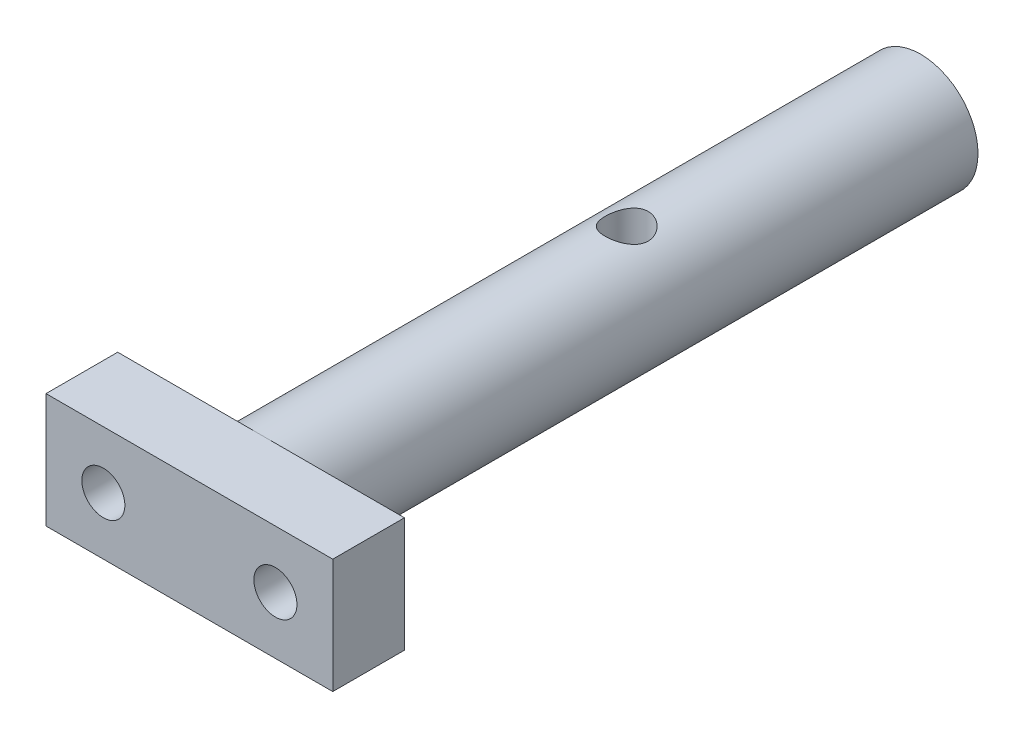
ISO-10303-21;
HEADER;
FILE_DESCRIPTION(('STEP AP214'),'2;1');
FILE_NAME('part.step','',(''),(''),'','','');
FILE_SCHEMA(('AUTOMOTIVE_DESIGN { 1 0 10303 214 1 1 1 1 }'));
ENDSEC;
DATA;
#1=APPLICATION_CONTEXT('core data for automotive mechanical design processes');
#2=APPLICATION_PROTOCOL_DEFINITION('international standard','automotive_design',2000,#1);
#3=PRODUCT_CONTEXT('',#1,'mechanical');
#4=PRODUCT('Part','Part','',(#3));
#5=PRODUCT_RELATED_PRODUCT_CATEGORY('part','',(#4));
#6=PRODUCT_DEFINITION_FORMATION('','',#4);
#7=PRODUCT_DEFINITION_CONTEXT('part definition',#1,'design');
#8=PRODUCT_DEFINITION('design','',#6,#7);
#9=PRODUCT_DEFINITION_SHAPE('','',#8);
#10=(LENGTH_UNIT() NAMED_UNIT(*) SI_UNIT(.MILLI.,.METRE.));
#11=(NAMED_UNIT(*) PLANE_ANGLE_UNIT() SI_UNIT($,.RADIAN.));
#12=(NAMED_UNIT(*) SI_UNIT($,.STERADIAN.) SOLID_ANGLE_UNIT());
#13=UNCERTAINTY_MEASURE_WITH_UNIT(LENGTH_MEASURE(1.E-05),#10,'distance_accuracy_value','');
#14=(GEOMETRIC_REPRESENTATION_CONTEXT(3) GLOBAL_UNCERTAINTY_ASSIGNED_CONTEXT((#13)) GLOBAL_UNIT_ASSIGNED_CONTEXT((#10,
#11,#12)) REPRESENTATION_CONTEXT('',''));
#15=CARTESIAN_POINT('',(0.,0.,0.));
#16=DIRECTION('',(0.,0.,1.));
#17=DIRECTION('',(1.,0.,0.));
#18=AXIS2_PLACEMENT_3D('',#15,#16,#17);
#19=CARTESIAN_POINT('',(0.,0.,46.));
#20=DIRECTION('',(0.,0.,-1.));
#21=DIRECTION('',(-1.,0.,0.));
#22=AXIS2_PLACEMENT_3D('',#19,#20,#21);
#23=CYLINDRICAL_SURFACE('',#22,4.);
#24=CARTESIAN_POINT('',(0.,-4.,22.));
#25=CARTESIAN_POINT('',(0.081235058937853,-4.00000217456151,22.0000029023031));
#26=CARTESIAN_POINT('',(0.162450241781792,-3.99750379283184,21.9933802397516));
#27=CARTESIAN_POINT('',(0.322453452352361,-3.98778696006928,21.9671718047301));
#28=CARTESIAN_POINT('',(0.401241827987616,-3.98056918893993,21.9475878995294));
#29=CARTESIAN_POINT('',(0.55406078499088,-3.96218832391545,21.8962469982282));
#30=CARTESIAN_POINT('',(0.628100224162279,-3.9510328434944,21.8645134831782));
#31=CARTESIAN_POINT('',(0.769799310160255,-3.92588767765353,21.7898935869842));
#32=CARTESIAN_POINT('',(0.837457239177881,-3.91189723227548,21.7470042144558));
#33=CARTESIAN_POINT('',(0.967346417045826,-3.88186246971217,21.6493874689291));
#34=CARTESIAN_POINT('',(1.02927073015119,-3.86576002583566,21.5942697377406));
#35=CARTESIAN_POINT('',(1.14324421474363,-3.83360220871327,21.4745895653412));
#36=CARTESIAN_POINT('',(1.19529036359203,-3.81754685135033,21.4100242439121));
#37=CARTESIAN_POINT('',(1.28998202215985,-3.78662470617731,21.2702825324768));
#38=CARTESIAN_POINT('',(1.3321939319576,-3.77182648820818,21.1947956334542));
#39=CARTESIAN_POINT('',(1.40318646334085,-3.74599860237433,21.0371516458315));
#40=CARTESIAN_POINT('',(1.43197244961239,-3.73496742975881,20.9549972368449));
#41=CARTESIAN_POINT('',(1.47408431017549,-3.71854412824136,20.7898832597418));
#42=CARTESIAN_POINT('',(1.48799593218558,-3.71293924350838,20.7070949615646));
#43=CARTESIAN_POINT('',(1.50179556531648,-3.70738061461215,20.5401838420062));
#44=CARTESIAN_POINT('',(1.50168936802631,-3.70742453659305,20.4560615861255));
#45=CARTESIAN_POINT('',(1.48790429610018,-3.71297511632054,20.294230474787));
#46=CARTESIAN_POINT('',(1.47503808509004,-3.71815468871122,20.2164390939558));
#47=CARTESIAN_POINT('',(1.4374416786833,-3.73284938059529,20.0642128495947));
#48=CARTESIAN_POINT('',(1.41270969663258,-3.74236515298863,19.9897784933861));
#49=CARTESIAN_POINT('',(1.35163748571904,-3.76485702190253,19.8447229322718));
#50=CARTESIAN_POINT('',(1.31508648737101,-3.77789517988166,19.7742005138787));
#51=CARTESIAN_POINT('',(1.23156073762698,-3.80594210139319,19.640054262409));
#52=CARTESIAN_POINT('',(1.18458238728897,-3.82095154457158,19.5764328224803));
#53=CARTESIAN_POINT('',(1.07781780766549,-3.85248038859113,19.4533963363491));
#54=CARTESIAN_POINT('',(1.01738298716956,-3.86903347455671,19.3945513592519));
#55=CARTESIAN_POINT('',(0.887312590819021,-3.90091728164086,19.2876620337942));
#56=CARTESIAN_POINT('',(0.817675603497365,-3.91624781465952,19.2396193453943));
#57=CARTESIAN_POINT('',(0.669723436992421,-3.9442639480908,19.1550696029375));
#58=CARTESIAN_POINT('',(0.591290713844721,-3.95690498259616,19.1187524187789));
#59=CARTESIAN_POINT('',(0.428836850524584,-3.97778718326962,19.06001739573));
#60=CARTESIAN_POINT('',(0.344818210845767,-3.98603030341493,19.0375933834389));
#61=CARTESIAN_POINT('',(0.178375243148664,-3.99684443228065,19.0083772124581));
#62=CARTESIAN_POINT('',(0.0961036195622083,-3.99969369025686,19.0008173936175));
#63=CARTESIAN_POINT('',(-0.0685724752550253,-4.00025893700126,18.9993089361001));
#64=CARTESIAN_POINT('',(-0.150976912983374,-3.99797606386863,19.0053572796832));
#65=CARTESIAN_POINT('',(-0.31026204856186,-3.98871709772643,19.0303100423087));
#66=CARTESIAN_POINT('',(-0.387233328007337,-3.98192470962305,19.0487115437371));
#67=CARTESIAN_POINT('',(-0.536941754957222,-3.96451477091717,19.0971860725473));
#68=CARTESIAN_POINT('',(-0.609678350347535,-3.9538967228203,19.127260617948));
#69=CARTESIAN_POINT('',(-0.751247765110157,-3.92949624407681,19.1991864124395));
#70=CARTESIAN_POINT('',(-0.819903083557797,-3.91563000209348,19.2413577292234));
#71=CARTESIAN_POINT('',(-0.949392711726627,-3.88626671564664,19.3359181031716));
#72=CARTESIAN_POINT('',(-1.01022412027045,-3.87076907009516,19.3883109325452));
#73=CARTESIAN_POINT('',(-1.12603079874455,-3.83873329490989,19.5054041221243));
#74=CARTESIAN_POINT('',(-1.18046154123569,-3.82218696503729,19.5706421827727));
#75=CARTESIAN_POINT('',(-1.27771050031904,-3.79078815746854,19.7096513847077));
#76=CARTESIAN_POINT('',(-1.32052767414519,-3.77593583194399,19.7834232913885));
#77=CARTESIAN_POINT('',(-1.39337773518998,-3.74966829822463,19.9380159867723));
#78=CARTESIAN_POINT('',(-1.42335685446918,-3.73826760328493,20.0188647459104));
#79=CARTESIAN_POINT('',(-1.46907883466889,-3.72054032891005,20.1850097636878));
#80=CARTESIAN_POINT('',(-1.48483050305535,-3.71421061057491,20.2703032361981));
#81=CARTESIAN_POINT('',(-1.50086347097839,-3.70775894792573,20.4370161595411));
#82=CARTESIAN_POINT('',(-1.50207331495837,-3.70726444523341,20.5183326317169));
#83=CARTESIAN_POINT('',(-1.49136715641593,-3.71158412745292,20.6799453162762));
#84=CARTESIAN_POINT('',(-1.47945239850124,-3.71639780898899,20.7602416246716));
#85=CARTESIAN_POINT('',(-1.44355815630242,-3.73048141585432,20.9150472267166));
#86=CARTESIAN_POINT('',(-1.41995798316524,-3.73961085376663,20.9896583462453));
#87=CARTESIAN_POINT('',(-1.3616969677992,-3.76121548297845,21.1339055084944));
#88=CARTESIAN_POINT('',(-1.32703332944945,-3.77369151995215,21.2035402880701));
#89=CARTESIAN_POINT('',(-1.24552075938154,-3.80139723903965,21.3398267896976));
#90=CARTESIAN_POINT('',(-1.1981283280301,-3.81673698440964,21.4061307967999));
#91=CARTESIAN_POINT('',(-1.09334485729906,-3.84806246757177,21.5301415609712));
#92=CARTESIAN_POINT('',(-1.03595064012808,-3.86404840943145,21.5878455747868));
#93=CARTESIAN_POINT('',(-0.909080396784624,-3.89590424609881,21.6962019558218));
#94=CARTESIAN_POINT('',(-0.839118644212994,-3.91172104900645,21.7463037534347));
#95=CARTESIAN_POINT('',(-0.691213223200822,-3.9405451445703,21.8340226552766));
#96=CARTESIAN_POINT('',(-0.613268934090623,-3.95355221851559,21.8716387877364));
#97=CARTESIAN_POINT('',(-0.447999082002313,-3.9757429260668,21.9343768290483));
#98=CARTESIAN_POINT('',(-0.360413422234209,-3.98473657158356,21.9588870646019));
#99=CARTESIAN_POINT('',(-0.181875733606382,-3.99686242179587,21.9916929599207));
#100=CARTESIAN_POINT('',(-0.090925416364859,-3.99999756603967,21.9999967514873));
#101=CARTESIAN_POINT('',(0.,-4.,22.));
#102=B_SPLINE_CURVE_WITH_KNOTS('',3,(#24,#25,#26,#27,#28,#29,#30,#31,#32,#33,#34,#35,#36,#37,
#38,#39,#40,#41,#42,#43,#44,#45,#46,#47,#48,#49,#50,#51,#52,#53,#54,#55,#56,#57,#58,#59,#60,#61,
#62,#63,#64,#65,#66,#67,#68,#69,#70,#71,#72,#73,#74,#75,#76,#77,#78,#79,#80,#81,#82,#83,#84,#85,
#86,#87,#88,#89,#90,#91,#92,#93,#94,#95,#96,#97,#98,#99,#100,#101),.UNSPECIFIED.,.T.,.F.,(4,2,2,
2,2,2,2,2,2,2,2,2,2,2,2,2,2,2,2,2,2,2,2,2,2,2,2,2,2,2,2,2,2,2,2,2,2,2,4),(0.,0.24336980156056,
0.486704549530461,0.729571369213574,0.972503379609491,1.22473618582715,1.47704604925622,
1.73896674501659,2.00078269352134,2.25185874416902,2.50283106079707,2.73878345119972,
2.97477138060589,3.21522408387018,3.45575990744259,3.71246153335813,3.96920257905066,
4.22991375286075,4.49050899698846,4.73725019635926,4.98393668390521,5.2211443792384,
5.45838293254454,5.702592218596,5.94689180019868,6.20536519455659,6.46386178920142,
6.72343066727205,6.98283874956508,7.22558763480253,7.46831350211259,7.70363142426534,
7.93900886656507,8.18672471884272,8.43451941997063,8.6957232965404,8.95694749805103,
9.22948515032043,9.50188601796128),.UNSPECIFIED.);
#103=CARTESIAN_POINT('',(0.,-4.,22.));
#104=VERTEX_POINT('',#103);
#105=EDGE_CURVE('E44',#104,#104,#102,.T.);
#106=ORIENTED_EDGE('',*,*,#105,.T.);
#107=EDGE_LOOP('',(#106));
#108=FACE_BOUND('',#107,.T.);
#109=CARTESIAN_POINT('',(0.,4.,22.));
#110=CARTESIAN_POINT('',(-0.081235058937853,4.00000217456151,22.0000029023031));
#111=CARTESIAN_POINT('',(-0.162450241781792,3.99750379283184,21.9933802397516));
#112=CARTESIAN_POINT('',(-0.322453452352361,3.98778696006928,21.9671718047301));
#113=CARTESIAN_POINT('',(-0.401241827987616,3.98056918893993,21.9475878995294));
#114=CARTESIAN_POINT('',(-0.55406078499088,3.96218832391545,21.8962469982282));
#115=CARTESIAN_POINT('',(-0.628100224162279,3.9510328434944,21.8645134831782));
#116=CARTESIAN_POINT('',(-0.769799310160255,3.92588767765353,21.7898935869842));
#117=CARTESIAN_POINT('',(-0.837457239177881,3.91189723227548,21.7470042144558));
#118=CARTESIAN_POINT('',(-0.967346417045826,3.88186246971217,21.6493874689291));
#119=CARTESIAN_POINT('',(-1.02927073015119,3.86576002583566,21.5942697377406));
#120=CARTESIAN_POINT('',(-1.14324421474363,3.83360220871327,21.4745895653412));
#121=CARTESIAN_POINT('',(-1.19529036359203,3.81754685135033,21.4100242439121));
#122=CARTESIAN_POINT('',(-1.28998202215985,3.78662470617731,21.2702825324768));
#123=CARTESIAN_POINT('',(-1.3321939319576,3.77182648820818,21.1947956334542));
#124=CARTESIAN_POINT('',(-1.40318646334085,3.74599860237433,21.0371516458315));
#125=CARTESIAN_POINT('',(-1.43197244961239,3.73496742975881,20.9549972368449));
#126=CARTESIAN_POINT('',(-1.47408431017549,3.71854412824136,20.7898832597418));
#127=CARTESIAN_POINT('',(-1.48799593218558,3.71293924350838,20.7070949615646));
#128=CARTESIAN_POINT('',(-1.50179556531648,3.70738061461215,20.5401838420062));
#129=CARTESIAN_POINT('',(-1.50168936802631,3.70742453659305,20.4560615861255));
#130=CARTESIAN_POINT('',(-1.48790429610018,3.71297511632054,20.294230474787));
#131=CARTESIAN_POINT('',(-1.47503808509004,3.71815468871122,20.2164390939558));
#132=CARTESIAN_POINT('',(-1.4374416786833,3.73284938059529,20.0642128495947));
#133=CARTESIAN_POINT('',(-1.41270969663258,3.74236515298863,19.9897784933861));
#134=CARTESIAN_POINT('',(-1.35163748571904,3.76485702190253,19.8447229322718));
#135=CARTESIAN_POINT('',(-1.31508648737101,3.77789517988166,19.7742005138787));
#136=CARTESIAN_POINT('',(-1.23156073762698,3.80594210139319,19.640054262409));
#137=CARTESIAN_POINT('',(-1.18458238728897,3.82095154457158,19.5764328224803));
#138=CARTESIAN_POINT('',(-1.07781780766549,3.85248038859113,19.4533963363491));
#139=CARTESIAN_POINT('',(-1.01738298716956,3.86903347455671,19.3945513592519));
#140=CARTESIAN_POINT('',(-0.887312590819021,3.90091728164086,19.2876620337942));
#141=CARTESIAN_POINT('',(-0.817675603497365,3.91624781465952,19.2396193453943));
#142=CARTESIAN_POINT('',(-0.669723436992421,3.9442639480908,19.1550696029375));
#143=CARTESIAN_POINT('',(-0.591290713844721,3.95690498259616,19.1187524187789));
#144=CARTESIAN_POINT('',(-0.428836850524584,3.97778718326962,19.06001739573));
#145=CARTESIAN_POINT('',(-0.344818210845767,3.98603030341493,19.0375933834389));
#146=CARTESIAN_POINT('',(-0.178375243148664,3.99684443228065,19.0083772124581));
#147=CARTESIAN_POINT('',(-0.0961036195622083,3.99969369025686,19.0008173936175));
#148=CARTESIAN_POINT('',(0.0685724752550253,4.00025893700126,18.9993089361001));
#149=CARTESIAN_POINT('',(0.150976912983374,3.99797606386863,19.0053572796832));
#150=CARTESIAN_POINT('',(0.31026204856186,3.98871709772643,19.0303100423087));
#151=CARTESIAN_POINT('',(0.387233328007337,3.98192470962305,19.0487115437371));
#152=CARTESIAN_POINT('',(0.536941754957222,3.96451477091717,19.0971860725473));
#153=CARTESIAN_POINT('',(0.609678350347535,3.9538967228203,19.127260617948));
#154=CARTESIAN_POINT('',(0.751247765110157,3.92949624407681,19.1991864124395));
#155=CARTESIAN_POINT('',(0.819903083557797,3.91563000209348,19.2413577292234));
#156=CARTESIAN_POINT('',(0.949392711726627,3.88626671564664,19.3359181031716));
#157=CARTESIAN_POINT('',(1.01022412027045,3.87076907009516,19.3883109325452));
#158=CARTESIAN_POINT('',(1.12603079874455,3.83873329490989,19.5054041221243));
#159=CARTESIAN_POINT('',(1.18046154123569,3.82218696503729,19.5706421827727));
#160=CARTESIAN_POINT('',(1.27771050031904,3.79078815746854,19.7096513847077));
#161=CARTESIAN_POINT('',(1.32052767414519,3.77593583194399,19.7834232913885));
#162=CARTESIAN_POINT('',(1.39337773518998,3.74966829822463,19.9380159867723));
#163=CARTESIAN_POINT('',(1.42335685446918,3.73826760328493,20.0188647459104));
#164=CARTESIAN_POINT('',(1.46907883466889,3.72054032891005,20.1850097636878));
#165=CARTESIAN_POINT('',(1.48483050305535,3.71421061057491,20.2703032361981));
#166=CARTESIAN_POINT('',(1.50086347097839,3.70775894792573,20.4370161595411));
#167=CARTESIAN_POINT('',(1.50207331495837,3.70726444523341,20.5183326317169));
#168=CARTESIAN_POINT('',(1.49136715641593,3.71158412745292,20.6799453162762));
#169=CARTESIAN_POINT('',(1.47945239850124,3.71639780898899,20.7602416246716));
#170=CARTESIAN_POINT('',(1.44355815630242,3.73048141585432,20.9150472267166));
#171=CARTESIAN_POINT('',(1.41995798316524,3.73961085376663,20.9896583462453));
#172=CARTESIAN_POINT('',(1.3616969677992,3.76121548297845,21.1339055084944));
#173=CARTESIAN_POINT('',(1.32703332944945,3.77369151995215,21.2035402880701));
#174=CARTESIAN_POINT('',(1.24552075938154,3.80139723903965,21.3398267896976));
#175=CARTESIAN_POINT('',(1.1981283280301,3.81673698440964,21.4061307967999));
#176=CARTESIAN_POINT('',(1.09334485729906,3.84806246757177,21.5301415609712));
#177=CARTESIAN_POINT('',(1.03595064012808,3.86404840943145,21.5878455747868));
#178=CARTESIAN_POINT('',(0.909080396784624,3.89590424609881,21.6962019558218));
#179=CARTESIAN_POINT('',(0.839118644212994,3.91172104900645,21.7463037534347));
#180=CARTESIAN_POINT('',(0.691213223200822,3.9405451445703,21.8340226552766));
#181=CARTESIAN_POINT('',(0.613268934090623,3.95355221851559,21.8716387877364));
#182=CARTESIAN_POINT('',(0.447999082002313,3.9757429260668,21.9343768290483));
#183=CARTESIAN_POINT('',(0.360413422234209,3.98473657158356,21.9588870646019));
#184=CARTESIAN_POINT('',(0.181875733606382,3.99686242179587,21.9916929599207));
#185=CARTESIAN_POINT('',(0.090925416364859,3.99999756603967,21.9999967514873));
#186=CARTESIAN_POINT('',(0.,4.,22.));
#187=B_SPLINE_CURVE_WITH_KNOTS('',3,(#109,#110,#111,#112,#113,#114,#115,#116,#117,#118,#119,
#120,#121,#122,#123,#124,#125,#126,#127,#128,#129,#130,#131,#132,#133,#134,#135,#136,#137,#138,
#139,#140,#141,#142,#143,#144,#145,#146,#147,#148,#149,#150,#151,#152,#153,#154,#155,#156,#157,
#158,#159,#160,#161,#162,#163,#164,#165,#166,#167,#168,#169,#170,#171,#172,#173,#174,#175,#176,
#177,#178,#179,#180,#181,#182,#183,#184,#185,#186),.UNSPECIFIED.,.T.,.F.,(4,2,2,2,2,2,2,2,2,2,2,
2,2,2,2,2,2,2,2,2,2,2,2,2,2,2,2,2,2,2,2,2,2,2,2,2,2,2,4),(0.,0.24336980156056,0.486704549530461,
0.729571369213574,0.972503379609491,1.22473618582715,1.47704604925622,1.73896674501659,
2.00078269352134,2.25185874416902,2.50283106079707,2.73878345119972,2.97477138060589,
3.21522408387018,3.45575990744259,3.71246153335813,3.96920257905066,4.22991375286075,
4.49050899698846,4.73725019635926,4.98393668390521,5.2211443792384,5.45838293254454,
5.702592218596,5.94689180019868,6.20536519455659,6.46386178920142,6.72343066727205,
6.98283874956508,7.22558763480253,7.46831350211259,7.70363142426534,7.93900886656507,
8.18672471884272,8.43451941997063,8.6957232965404,8.95694749805103,9.22948515032043,
9.50188601796128),.UNSPECIFIED.);
#188=CARTESIAN_POINT('',(0.,4.,22.));
#189=VERTEX_POINT('',#188);
#190=EDGE_CURVE('E122',#189,#189,#187,.T.);
#191=ORIENTED_EDGE('',*,*,#190,.T.);
#192=EDGE_LOOP('',(#191));
#193=FACE_BOUND('',#192,.T.);
#194=CARTESIAN_POINT('',(0.,0.,46.));
#195=DIRECTION('',(0.,0.,1.));
#196=DIRECTION('',(1.,0.,0.));
#197=AXIS2_PLACEMENT_3D('',#194,#195,#196);
#198=CIRCLE('',#197,4.);
#199=CARTESIAN_POINT('',(0.,4.,46.));
#200=VERTEX_POINT('',#199);
#201=CARTESIAN_POINT('',(0.,-4.,46.));
#202=VERTEX_POINT('',#201);
#203=EDGE_CURVE('E11',#200,#202,#198,.T.);
#204=ORIENTED_EDGE('',*,*,#203,.F.);
#205=EDGE_CURVE('E53',#202,#200,#198,.T.);
#206=ORIENTED_EDGE('',*,*,#205,.F.);
#207=EDGE_LOOP('',(#204,#206));
#208=FACE_BOUND('',#207,.T.);
#209=CARTESIAN_POINT('',(0.,0.,0.));
#210=DIRECTION('',(0.,0.,1.));
#211=DIRECTION('',(1.,0.,0.));
#212=AXIS2_PLACEMENT_3D('',#209,#210,#211);
#213=CIRCLE('',#212,4.);
#214=CARTESIAN_POINT('',(4.,0.,0.));
#215=VERTEX_POINT('',#214);
#216=EDGE_CURVE('E111',#215,#215,#213,.T.);
#217=ORIENTED_EDGE('',*,*,#216,.T.);
#218=EDGE_LOOP('',(#217));
#219=FACE_BOUND('',#218,.T.);
#220=ADVANCED_FACE('F41',(#108,#193,#208,#219),#23,.T.);
#221=CARTESIAN_POINT('',(0.,0.,0.));
#222=DIRECTION('',(0.,0.,1.));
#223=DIRECTION('',(1.,0.,0.));
#224=AXIS2_PLACEMENT_3D('',#221,#222,#223);
#225=PLANE('',#224);
#226=ORIENTED_EDGE('',*,*,#216,.F.);
#227=EDGE_LOOP('',(#226));
#228=FACE_BOUND('',#227,.T.);
#229=ADVANCED_FACE('F157',(#228),#225,.F.);
#230=CARTESIAN_POINT('',(0.,0.,46.));
#231=DIRECTION('',(0.,0.,-1.));
#232=DIRECTION('',(-1.,0.,0.));
#233=AXIS2_PLACEMENT_3D('',#230,#231,#232);
#234=PLANE('',#233);
#235=CARTESIAN_POINT('',(-6.,0.,46.));
#236=DIRECTION('',(0.,0.,-1.));
#237=DIRECTION('',(-1.,0.,0.));
#238=AXIS2_PLACEMENT_3D('',#235,#236,#237);
#239=CIRCLE('',#238,1.5);
#240=CARTESIAN_POINT('',(-7.5,0.,46.));
#241=VERTEX_POINT('',#240);
#242=EDGE_CURVE('E176',#241,#241,#239,.F.);
#243=ORIENTED_EDGE('',*,*,#242,.T.);
#244=EDGE_LOOP('',(#243));
#245=FACE_BOUND('',#244,.T.);
#246=DIRECTION('',(-1.,0.,0.));
#247=VECTOR('',#246,1.);
#248=CARTESIAN_POINT('',(10.,4.,46.));
#249=LINE('',#248,#247);
#250=CARTESIAN_POINT('',(-10.,4.,46.));
#251=VERTEX_POINT('',#250);
#252=EDGE_CURVE('E196',#200,#251,#249,.T.);
#253=ORIENTED_EDGE('',*,*,#252,.F.);
#254=ORIENTED_EDGE('',*,*,#203,.T.);
#255=DIRECTION('',(1.,0.,0.));
#256=VECTOR('',#255,1.);
#257=CARTESIAN_POINT('',(10.,-4.,46.));
#258=LINE('',#257,#256);
#259=CARTESIAN_POINT('',(-10.,-4.,46.));
#260=VERTEX_POINT('',#259);
#261=EDGE_CURVE('E191',#260,#202,#258,.T.);
#262=ORIENTED_EDGE('',*,*,#261,.F.);
#263=DIRECTION('',(0.,-1.,0.));
#264=VECTOR('',#263,1.);
#265=CARTESIAN_POINT('',(-10.,4.,46.));
#266=LINE('',#265,#264);
#267=EDGE_CURVE('E114',#251,#260,#266,.T.);
#268=ORIENTED_EDGE('',*,*,#267,.F.);
#269=EDGE_LOOP('',(#253,#254,#262,#268));
#270=FACE_BOUND('',#269,.T.);
#271=ADVANCED_FACE('F146',(#245,#270),#234,.T.);
#272=CARTESIAN_POINT('',(-10.,4.,51.));
#273=DIRECTION('',(1.,0.,0.));
#274=DIRECTION('',(0.,0.,-1.));
#275=AXIS2_PLACEMENT_3D('',#272,#273,#274);
#276=PLANE('',#275);
#277=ORIENTED_EDGE('',*,*,#267,.T.);
#278=DIRECTION('',(0.,0.,-1.));
#279=VECTOR('',#278,1.);
#280=CARTESIAN_POINT('',(-10.,-4.,51.));
#281=LINE('',#280,#279);
#282=CARTESIAN_POINT('',(-10.,-4.,51.));
#283=VERTEX_POINT('',#282);
#284=EDGE_CURVE('E91',#283,#260,#281,.T.);
#285=ORIENTED_EDGE('',*,*,#284,.F.);
#286=DIRECTION('',(0.,-1.,0.));
#287=VECTOR('',#286,1.);
#288=CARTESIAN_POINT('',(-10.,4.,51.));
#289=LINE('',#288,#287);
#290=CARTESIAN_POINT('',(-10.,4.,51.));
#291=VERTEX_POINT('',#290);
#292=EDGE_CURVE('E99',#291,#283,#289,.T.);
#293=ORIENTED_EDGE('',*,*,#292,.F.);
#294=DIRECTION('',(0.,0.,-1.));
#295=VECTOR('',#294,1.);
#296=CARTESIAN_POINT('',(-10.,4.,51.));
#297=LINE('',#296,#295);
#298=EDGE_CURVE('E190',#291,#251,#297,.T.);
#299=ORIENTED_EDGE('',*,*,#298,.T.);
#300=EDGE_LOOP('',(#277,#285,#293,#299));
#301=FACE_BOUND('',#300,.T.);
#302=ADVANCED_FACE('F112',(#301),#276,.F.);
#303=CARTESIAN_POINT('',(10.,-4.,51.));
#304=DIRECTION('',(0.,1.,0.));
#305=DIRECTION('',(0.,0.,1.));
#306=AXIS2_PLACEMENT_3D('',#303,#304,#305);
#307=PLANE('',#306);
#308=ORIENTED_EDGE('',*,*,#261,.T.);
#309=CARTESIAN_POINT('',(10.,-4.,46.));
#310=VERTEX_POINT('',#309);
#311=EDGE_CURVE('E194',#202,#310,#258,.T.);
#312=ORIENTED_EDGE('',*,*,#311,.T.);
#313=DIRECTION('',(0.,0.,-1.));
#314=VECTOR('',#313,1.);
#315=CARTESIAN_POINT('',(10.,-4.,51.));
#316=LINE('',#315,#314);
#317=CARTESIAN_POINT('',(10.,-4.,51.));
#318=VERTEX_POINT('',#317);
#319=EDGE_CURVE('E96',#318,#310,#316,.T.);
#320=ORIENTED_EDGE('',*,*,#319,.F.);
#321=DIRECTION('',(1.,0.,0.));
#322=VECTOR('',#321,1.);
#323=CARTESIAN_POINT('',(10.,-4.,51.));
#324=LINE('',#323,#322);
#325=EDGE_CURVE('E86',#283,#318,#324,.T.);
#326=ORIENTED_EDGE('',*,*,#325,.F.);
#327=ORIENTED_EDGE('',*,*,#284,.T.);
#328=EDGE_LOOP('',(#308,#312,#320,#326,#327));
#329=FACE_BOUND('',#328,.T.);
#330=ADVANCED_FACE('F93',(#329),#307,.F.);
#331=CARTESIAN_POINT('',(10.,4.,51.));
#332=DIRECTION('',(-1.,0.,0.));
#333=DIRECTION('',(0.,0.,1.));
#334=AXIS2_PLACEMENT_3D('',#331,#332,#333);
#335=PLANE('',#334);
#336=DIRECTION('',(0.,1.,0.));
#337=VECTOR('',#336,1.);
#338=CARTESIAN_POINT('',(10.,4.,46.));
#339=LINE('',#338,#337);
#340=CARTESIAN_POINT('',(10.,4.,46.));
#341=VERTEX_POINT('',#340);
#342=EDGE_CURVE('E198',#310,#341,#339,.T.);
#343=ORIENTED_EDGE('',*,*,#342,.T.);
#344=DIRECTION('',(0.,0.,-1.));
#345=VECTOR('',#344,1.);
#346=CARTESIAN_POINT('',(10.,4.,51.));
#347=LINE('',#346,#345);
#348=CARTESIAN_POINT('',(10.,4.,51.));
#349=VERTEX_POINT('',#348);
#350=EDGE_CURVE('E119',#349,#341,#347,.T.);
#351=ORIENTED_EDGE('',*,*,#350,.F.);
#352=DIRECTION('',(0.,1.,0.));
#353=VECTOR('',#352,1.);
#354=CARTESIAN_POINT('',(10.,4.,51.));
#355=LINE('',#354,#353);
#356=EDGE_CURVE('E97',#318,#349,#355,.T.);
#357=ORIENTED_EDGE('',*,*,#356,.F.);
#358=ORIENTED_EDGE('',*,*,#319,.T.);
#359=EDGE_LOOP('',(#343,#351,#357,#358));
#360=FACE_BOUND('',#359,.T.);
#361=ADVANCED_FACE('F151',(#360),#335,.F.);
#362=CARTESIAN_POINT('',(10.,4.,51.));
#363=DIRECTION('',(0.,-1.,0.));
#364=DIRECTION('',(0.,0.,-1.));
#365=AXIS2_PLACEMENT_3D('',#362,#363,#364);
#366=PLANE('',#365);
#367=EDGE_CURVE('E108',#341,#200,#249,.T.);
#368=ORIENTED_EDGE('',*,*,#367,.T.);
#369=ORIENTED_EDGE('',*,*,#252,.T.);
#370=ORIENTED_EDGE('',*,*,#298,.F.);
#371=DIRECTION('',(-1.,0.,0.));
#372=VECTOR('',#371,1.);
#373=CARTESIAN_POINT('',(10.,4.,51.));
#374=LINE('',#373,#372);
#375=EDGE_CURVE('E104',#349,#291,#374,.T.);
#376=ORIENTED_EDGE('',*,*,#375,.F.);
#377=ORIENTED_EDGE('',*,*,#350,.T.);
#378=EDGE_LOOP('',(#368,#369,#370,#376,#377));
#379=FACE_BOUND('',#378,.T.);
#380=ADVANCED_FACE('F141',(#379),#366,.F.);
#381=CARTESIAN_POINT('',(0.,0.,51.));
#382=DIRECTION('',(0.,0.,-1.));
#383=DIRECTION('',(-1.,0.,0.));
#384=AXIS2_PLACEMENT_3D('',#381,#382,#383);
#385=PLANE('',#384);
#386=CARTESIAN_POINT('',(6.,0.,51.));
#387=DIRECTION('',(0.,0.,1.));
#388=DIRECTION('',(1.,0.,0.));
#389=AXIS2_PLACEMENT_3D('',#386,#387,#388);
#390=CIRCLE('',#389,1.5);
#391=CARTESIAN_POINT('',(7.5,0.,51.));
#392=VERTEX_POINT('',#391);
#393=EDGE_CURVE('E195',#392,#392,#390,.T.);
#394=ORIENTED_EDGE('',*,*,#393,.F.);
#395=EDGE_LOOP('',(#394));
#396=FACE_BOUND('',#395,.T.);
#397=CARTESIAN_POINT('',(-6.,0.,51.));
#398=DIRECTION('',(0.,0.,1.));
#399=DIRECTION('',(-1.,0.,0.));
#400=AXIS2_PLACEMENT_3D('',#397,#398,#399);
#401=CIRCLE('',#400,1.5);
#402=CARTESIAN_POINT('',(-7.5,0.,51.));
#403=VERTEX_POINT('',#402);
#404=EDGE_CURVE('E179',#403,#403,#401,.T.);
#405=ORIENTED_EDGE('',*,*,#404,.F.);
#406=EDGE_LOOP('',(#405));
#407=FACE_BOUND('',#406,.T.);
#408=ORIENTED_EDGE('',*,*,#292,.T.);
#409=ORIENTED_EDGE('',*,*,#325,.T.);
#410=ORIENTED_EDGE('',*,*,#356,.T.);
#411=ORIENTED_EDGE('',*,*,#375,.T.);
#412=EDGE_LOOP('',(#408,#409,#410,#411));
#413=FACE_BOUND('',#412,.T.);
#414=ADVANCED_FACE('F103',(#396,#407,#413),#385,.F.);
#415=CARTESIAN_POINT('',(6.,0.,46.));
#416=DIRECTION('',(0.,0.,-1.));
#417=DIRECTION('',(-1.,0.,0.));
#418=AXIS2_PLACEMENT_3D('',#415,#416,#417);
#419=CIRCLE('',#418,1.5);
#420=CARTESIAN_POINT('',(4.5,0.,46.));
#421=VERTEX_POINT('',#420);
#422=EDGE_CURVE('E184',#421,#421,#419,.F.);
#423=ORIENTED_EDGE('',*,*,#422,.T.);
#424=EDGE_LOOP('',(#423));
#425=FACE_BOUND('',#424,.T.);
#426=ORIENTED_EDGE('',*,*,#311,.F.);
#427=ORIENTED_EDGE('',*,*,#205,.T.);
#428=ORIENTED_EDGE('',*,*,#367,.F.);
#429=ORIENTED_EDGE('',*,*,#342,.F.);
#430=EDGE_LOOP('',(#426,#427,#428,#429));
#431=FACE_BOUND('',#430,.T.);
#432=ADVANCED_FACE('F137',(#425,#431),#234,.T.);
#433=CARTESIAN_POINT('',(6.,0.,-0.001000000000001));
#434=DIRECTION('',(0.,0.,1.));
#435=DIRECTION('',(1.,0.,0.));
#436=AXIS2_PLACEMENT_3D('',#433,#434,#435);
#437=CYLINDRICAL_SURFACE('',#436,1.5);
#438=ORIENTED_EDGE('',*,*,#422,.F.);
#439=EDGE_LOOP('',(#438));
#440=FACE_BOUND('',#439,.T.);
#441=ORIENTED_EDGE('',*,*,#393,.T.);
#442=EDGE_LOOP('',(#441));
#443=FACE_BOUND('',#442,.T.);
#444=ADVANCED_FACE('F132',(#440,#443),#437,.F.);
#445=CARTESIAN_POINT('',(-6.,0.,-0.001000000000001));
#446=DIRECTION('',(0.,0.,1.));
#447=DIRECTION('',(1.,0.,0.));
#448=AXIS2_PLACEMENT_3D('',#445,#446,#447);
#449=CYLINDRICAL_SURFACE('',#448,1.5);
#450=ORIENTED_EDGE('',*,*,#242,.F.);
#451=EDGE_LOOP('',(#450));
#452=FACE_BOUND('',#451,.T.);
#453=ORIENTED_EDGE('',*,*,#404,.T.);
#454=EDGE_LOOP('',(#453));
#455=FACE_BOUND('',#454,.T.);
#456=ADVANCED_FACE('F128',(#452,#455),#449,.F.);
#457=CARTESIAN_POINT('',(0.,-5.,20.5));
#458=DIRECTION('',(0.,1.,0.));
#459=DIRECTION('',(0.,0.,1.));
#460=AXIS2_PLACEMENT_3D('',#457,#458,#459);
#461=CYLINDRICAL_SURFACE('',#460,1.5);
#462=ORIENTED_EDGE('',*,*,#190,.F.);
#463=EDGE_LOOP('',(#462));
#464=FACE_BOUND('',#463,.T.);
#465=ORIENTED_EDGE('',*,*,#105,.F.);
#466=EDGE_LOOP('',(#465));
#467=FACE_BOUND('',#466,.T.);
#468=ADVANCED_FACE('F127',(#464,#467),#461,.F.);
#469=CLOSED_SHELL('',(#220,#229,#271,#302,#330,#361,#380,#414,#432,#444,#456,#468));
#470=MANIFOLD_SOLID_BREP('B2',#469);
#471=ADVANCED_BREP_SHAPE_REPRESENTATION('',(#18,#470),#14);
#472=SHAPE_DEFINITION_REPRESENTATION(#9,#471);
ENDSEC;
END-ISO-10303-21;
